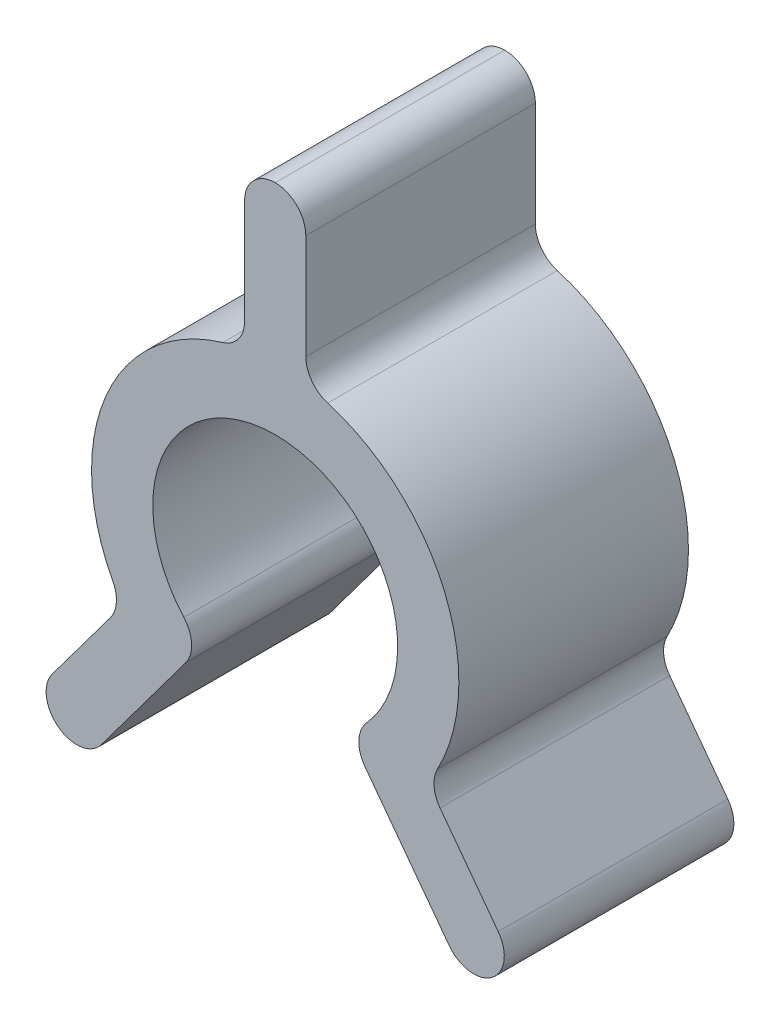
ISO-10303-21;
HEADER;
FILE_DESCRIPTION(('STEP AP214'),'2;1');
FILE_NAME('part.step','',(''),(''),'','','');
FILE_SCHEMA(('AUTOMOTIVE_DESIGN { 1 0 10303 214 1 1 1 1 }'));
ENDSEC;
DATA;
#1=APPLICATION_CONTEXT('core data for automotive mechanical design processes');
#2=APPLICATION_PROTOCOL_DEFINITION('international standard','automotive_design',2000,#1);
#3=PRODUCT_CONTEXT('',#1,'mechanical');
#4=PRODUCT('Part','Part','',(#3));
#5=PRODUCT_RELATED_PRODUCT_CATEGORY('part','',(#4));
#6=PRODUCT_DEFINITION_FORMATION('','',#4);
#7=PRODUCT_DEFINITION_CONTEXT('part definition',#1,'design');
#8=PRODUCT_DEFINITION('design','',#6,#7);
#9=PRODUCT_DEFINITION_SHAPE('','',#8);
#10=(LENGTH_UNIT() NAMED_UNIT(*) SI_UNIT(.MILLI.,.METRE.));
#11=(NAMED_UNIT(*) PLANE_ANGLE_UNIT() SI_UNIT($,.RADIAN.));
#12=(NAMED_UNIT(*) SI_UNIT($,.STERADIAN.) SOLID_ANGLE_UNIT());
#13=UNCERTAINTY_MEASURE_WITH_UNIT(LENGTH_MEASURE(1.E-05),#10,'distance_accuracy_value','');
#14=(GEOMETRIC_REPRESENTATION_CONTEXT(3) GLOBAL_UNCERTAINTY_ASSIGNED_CONTEXT((#13)) GLOBAL_UNIT_ASSIGNED_CONTEXT((#10,
#11,#12)) REPRESENTATION_CONTEXT('',''));
#15=CARTESIAN_POINT('',(0.,0.,0.));
#16=DIRECTION('',(0.,0.,1.));
#17=DIRECTION('',(1.,0.,0.));
#18=AXIS2_PLACEMENT_3D('',#15,#16,#17);
#19=CARTESIAN_POINT('',(0.,0.,7.5));
#20=DIRECTION('',(0.,0.,-1.));
#21=DIRECTION('',(-1.,0.,0.));
#22=AXIS2_PLACEMENT_3D('',#19,#20,#21);
#23=CYLINDRICAL_SURFACE('',#22,4.);
#24=CARTESIAN_POINT('',(0.,0.,2.));
#25=DIRECTION('',(0.,0.,-1.));
#26=DIRECTION('',(-1.,0.,0.));
#27=AXIS2_PLACEMENT_3D('',#24,#25,#26);
#28=CIRCLE('',#27,4.);
#29=CARTESIAN_POINT('',(0.,4.,2.));
#30=VERTEX_POINT('',#29);
#31=CARTESIAN_POINT('',(-3.46410161513775,2.,2.));
#32=VERTEX_POINT('',#31);
#33=EDGE_CURVE('E247',#30,#32,#28,.F.);
#34=ORIENTED_EDGE('',*,*,#33,.F.);
#35=CARTESIAN_POINT('',(0.,0.,2.));
#36=DIRECTION('',(0.,0.,-1.));
#37=DIRECTION('',(-1.,0.,0.));
#38=AXIS2_PLACEMENT_3D('',#35,#36,#37);
#39=CIRCLE('',#38,4.);
#40=CARTESIAN_POINT('',(3.46410161513775,2.,2.));
#41=VERTEX_POINT('',#40);
#42=EDGE_CURVE('E269',#41,#30,#39,.F.);
#43=ORIENTED_EDGE('',*,*,#42,.F.);
#44=DIRECTION('',(0.,0.,-1.));
#45=VECTOR('',#44,1.);
#46=CARTESIAN_POINT('',(3.46410161513775,2.,2.));
#47=LINE('',#46,#45);
#48=CARTESIAN_POINT('',(3.46410161513775,2.,0.));
#49=VERTEX_POINT('',#48);
#50=EDGE_CURVE('E272',#41,#49,#47,.T.);
#51=ORIENTED_EDGE('',*,*,#50,.T.);
#52=CARTESIAN_POINT('',(0.,0.,0.));
#53=DIRECTION('',(0.,0.,1.));
#54=DIRECTION('',(1.,0.,0.));
#55=AXIS2_PLACEMENT_3D('',#52,#53,#54);
#56=CIRCLE('',#55,4.);
#57=CARTESIAN_POINT('',(2.9853643169582,-2.66225466382026,0.));
#58=VERTEX_POINT('',#57);
#59=EDGE_CURVE('E327',#58,#49,#56,.T.);
#60=ORIENTED_EDGE('',*,*,#59,.F.);
#61=DIRECTION('',(0.,0.,-1.));
#62=VECTOR('',#61,1.);
#63=CARTESIAN_POINT('',(2.9853643169582,-2.66225466382026,7.5));
#64=LINE('',#63,#62);
#65=CARTESIAN_POINT('',(2.9853643169582,-2.66225466382026,7.5));
#66=VERTEX_POINT('',#65);
#67=EDGE_CURVE('E408',#58,#66,#64,.F.);
#68=ORIENTED_EDGE('',*,*,#67,.T.);
#69=CARTESIAN_POINT('',(0.,0.,7.5));
#70=DIRECTION('',(0.,0.,1.));
#71=DIRECTION('',(1.,0.,0.));
#72=AXIS2_PLACEMENT_3D('',#69,#70,#71);
#73=CIRCLE('',#72,4.);
#74=CARTESIAN_POINT('',(-2.9853643169582,-2.66225466382026,7.5));
#75=VERTEX_POINT('',#74);
#76=EDGE_CURVE('E298',#66,#75,#73,.T.);
#77=ORIENTED_EDGE('',*,*,#76,.T.);
#78=DIRECTION('',(0.,0.,-1.));
#79=VECTOR('',#78,1.);
#80=CARTESIAN_POINT('',(-2.9853643169582,-2.66225466382026,7.5));
#81=LINE('',#80,#79);
#82=CARTESIAN_POINT('',(-2.9853643169582,-2.66225466382026,0.));
#83=VERTEX_POINT('',#82);
#84=EDGE_CURVE('E406',#75,#83,#81,.T.);
#85=ORIENTED_EDGE('',*,*,#84,.T.);
#86=CARTESIAN_POINT('',(-3.46410161513775,2.,0.));
#87=VERTEX_POINT('',#86);
#88=EDGE_CURVE('E258',#87,#83,#56,.T.);
#89=ORIENTED_EDGE('',*,*,#88,.F.);
#90=DIRECTION('',(0.,0.,-1.));
#91=VECTOR('',#90,1.);
#92=CARTESIAN_POINT('',(-3.46410161513775,2.,2.));
#93=LINE('',#92,#91);
#94=EDGE_CURVE('E239',#32,#87,#93,.T.);
#95=ORIENTED_EDGE('',*,*,#94,.F.);
#96=EDGE_LOOP('',(#34,#43,#51,#60,#68,#77,#85,#89,#95));
#97=FACE_BOUND('',#96,.T.);
#98=ADVANCED_FACE('F34',(#97),#23,.F.);
#99=CARTESIAN_POINT('',(0.,0.,7.5));
#100=DIRECTION('',(0.,0.,-1.));
#101=DIRECTION('',(-1.,0.,0.));
#102=AXIS2_PLACEMENT_3D('',#99,#100,#101);
#103=CYLINDRICAL_SURFACE('',#102,6.);
#104=CARTESIAN_POINT('',(0.,0.,0.));
#105=DIRECTION('',(0.,0.,1.));
#106=DIRECTION('',(1.,0.,0.));
#107=AXIS2_PLACEMENT_3D('',#104,#105,#106);
#108=CIRCLE('',#107,6.);
#109=CARTESIAN_POINT('',(5.30329882536313,-2.80624688309886,0.));
#110=VERTEX_POINT('',#109);
#111=CARTESIAN_POINT('',(1.71428571428571,5.74988908499946,0.));
#112=VERTEX_POINT('',#111);
#113=EDGE_CURVE('E308',#110,#112,#108,.T.);
#114=ORIENTED_EDGE('',*,*,#113,.T.);
#115=DIRECTION('',(0.,0.,-1.));
#116=VECTOR('',#115,1.);
#117=CARTESIAN_POINT('',(1.71428571428571,5.74988908499946,7.5));
#118=LINE('',#117,#116);
#119=CARTESIAN_POINT('',(1.71428571428571,5.74988908499946,7.5));
#120=VERTEX_POINT('',#119);
#121=EDGE_CURVE('E384',#112,#120,#118,.F.);
#122=ORIENTED_EDGE('',*,*,#121,.T.);
#123=CARTESIAN_POINT('',(0.,0.,7.5));
#124=DIRECTION('',(0.,0.,1.));
#125=DIRECTION('',(1.,0.,0.));
#126=AXIS2_PLACEMENT_3D('',#123,#124,#125);
#127=CIRCLE('',#126,6.);
#128=CARTESIAN_POINT('',(5.30329882536313,-2.80624688309886,7.5));
#129=VERTEX_POINT('',#128);
#130=EDGE_CURVE('E279',#129,#120,#127,.T.);
#131=ORIENTED_EDGE('',*,*,#130,.F.);
#132=DIRECTION('',(0.,0.,-1.));
#133=VECTOR('',#132,1.);
#134=CARTESIAN_POINT('',(5.30329882536313,-2.80624688309886,7.5));
#135=LINE('',#134,#133);
#136=EDGE_CURVE('E381',#129,#110,#135,.T.);
#137=ORIENTED_EDGE('',*,*,#136,.T.);
#138=EDGE_LOOP('',(#114,#122,#131,#137));
#139=FACE_BOUND('',#138,.T.);
#140=ADVANCED_FACE('F517',(#139),#103,.T.);
#141=CARTESIAN_POINT('',(1.,0.,7.5));
#142=DIRECTION('',(-1.,0.,0.));
#143=DIRECTION('',(0.,0.,1.));
#144=AXIS2_PLACEMENT_3D('',#141,#142,#143);
#145=PLANE('',#144);
#146=DIRECTION('',(0.,1.,0.));
#147=VECTOR('',#146,1.);
#148=CARTESIAN_POINT('',(1.,0.,0.));
#149=LINE('',#148,#147);
#150=CARTESIAN_POINT('',(1.,6.70820393249937,0.));
#151=VERTEX_POINT('',#150);
#152=CARTESIAN_POINT('',(1.,10.1276449163926,0.));
#153=VERTEX_POINT('',#152);
#154=EDGE_CURVE('E311',#151,#153,#149,.T.);
#155=ORIENTED_EDGE('',*,*,#154,.T.);
#156=DIRECTION('',(0.,0.,-1.));
#157=VECTOR('',#156,1.);
#158=CARTESIAN_POINT('',(1.,10.1276449163926,7.5));
#159=LINE('',#158,#157);
#160=CARTESIAN_POINT('',(1.,10.1276449163926,7.5));
#161=VERTEX_POINT('',#160);
#162=EDGE_CURVE('E379',#153,#161,#159,.F.);
#163=ORIENTED_EDGE('',*,*,#162,.T.);
#164=DIRECTION('',(0.,1.,0.));
#165=VECTOR('',#164,1.);
#166=CARTESIAN_POINT('',(1.,0.,7.5));
#167=LINE('',#166,#165);
#168=CARTESIAN_POINT('',(1.,6.70820393249937,7.5));
#169=VERTEX_POINT('',#168);
#170=EDGE_CURVE('E282',#169,#161,#167,.T.);
#171=ORIENTED_EDGE('',*,*,#170,.F.);
#172=DIRECTION('',(0.,0.,1.));
#173=VECTOR('',#172,1.);
#174=CARTESIAN_POINT('',(1.,6.70820393249937,0.));
#175=LINE('',#174,#173);
#176=EDGE_CURVE('E376',#169,#151,#175,.F.);
#177=ORIENTED_EDGE('',*,*,#176,.T.);
#178=EDGE_LOOP('',(#155,#163,#171,#177));
#179=FACE_BOUND('',#178,.T.);
#180=ADVANCED_FACE('F526',(#179),#145,.F.);
#181=CARTESIAN_POINT('',(-1.,0.,7.5));
#182=DIRECTION('',(-1.,0.,0.));
#183=DIRECTION('',(0.,0.,1.));
#184=AXIS2_PLACEMENT_3D('',#181,#182,#183);
#185=PLANE('',#184);
#186=DIRECTION('',(0.,1.,0.));
#187=VECTOR('',#186,1.);
#188=CARTESIAN_POINT('',(-1.,0.,0.));
#189=LINE('',#188,#187);
#190=CARTESIAN_POINT('',(-1.,6.70820393249937,0.));
#191=VERTEX_POINT('',#190);
#192=CARTESIAN_POINT('',(-1.,10.1276449163926,0.));
#193=VERTEX_POINT('',#192);
#194=EDGE_CURVE('E315',#191,#193,#189,.T.);
#195=ORIENTED_EDGE('',*,*,#194,.F.);
#196=DIRECTION('',(0.,0.,-1.));
#197=VECTOR('',#196,1.);
#198=CARTESIAN_POINT('',(-1.,6.70820393249937,7.5));
#199=LINE('',#198,#197);
#200=CARTESIAN_POINT('',(-1.,6.70820393249937,7.5));
#201=VERTEX_POINT('',#200);
#202=EDGE_CURVE('E342',#191,#201,#199,.F.);
#203=ORIENTED_EDGE('',*,*,#202,.T.);
#204=DIRECTION('',(0.,1.,0.));
#205=VECTOR('',#204,1.);
#206=CARTESIAN_POINT('',(-1.,0.,7.5));
#207=LINE('',#206,#205);
#208=CARTESIAN_POINT('',(-1.,10.1276449163926,7.5));
#209=VERTEX_POINT('',#208);
#210=EDGE_CURVE('E286',#201,#209,#207,.T.);
#211=ORIENTED_EDGE('',*,*,#210,.T.);
#212=DIRECTION('',(0.,0.,-1.));
#213=VECTOR('',#212,1.);
#214=CARTESIAN_POINT('',(-1.,10.1276449163926,0.));
#215=LINE('',#214,#213);
#216=EDGE_CURVE('E339',#209,#193,#215,.T.);
#217=ORIENTED_EDGE('',*,*,#216,.T.);
#218=EDGE_LOOP('',(#195,#203,#211,#217));
#219=FACE_BOUND('',#218,.T.);
#220=ADVANCED_FACE('F541',(#219),#185,.T.);
#221=CARTESIAN_POINT('',(0.,0.,7.5));
#222=DIRECTION('',(0.,0.,-1.));
#223=DIRECTION('',(-1.,0.,0.));
#224=AXIS2_PLACEMENT_3D('',#221,#222,#223);
#225=CYLINDRICAL_SURFACE('',#224,6.);
#226=CARTESIAN_POINT('',(0.,0.,7.5));
#227=DIRECTION('',(0.,0.,1.));
#228=DIRECTION('',(1.,0.,0.));
#229=AXIS2_PLACEMENT_3D('',#226,#227,#228);
#230=CIRCLE('',#229,6.);
#231=CARTESIAN_POINT('',(-1.71428571428571,5.74988908499946,7.5));
#232=VERTEX_POINT('',#231);
#233=CARTESIAN_POINT('',(-5.30329882536313,-2.80624688309886,7.5));
#234=VERTEX_POINT('',#233);
#235=EDGE_CURVE('E289',#232,#234,#230,.T.);
#236=ORIENTED_EDGE('',*,*,#235,.F.);
#237=DIRECTION('',(0.,0.,-1.));
#238=VECTOR('',#237,1.);
#239=CARTESIAN_POINT('',(-1.71428571428571,5.74988908499946,7.5));
#240=LINE('',#239,#238);
#241=CARTESIAN_POINT('',(-1.71428571428571,5.74988908499946,0.));
#242=VERTEX_POINT('',#241);
#243=EDGE_CURVE('E336',#232,#242,#240,.T.);
#244=ORIENTED_EDGE('',*,*,#243,.T.);
#245=CARTESIAN_POINT('',(0.,0.,0.));
#246=DIRECTION('',(0.,0.,1.));
#247=DIRECTION('',(1.,0.,0.));
#248=AXIS2_PLACEMENT_3D('',#245,#246,#247);
#249=CIRCLE('',#248,6.);
#250=CARTESIAN_POINT('',(-5.30329882536313,-2.80624688309886,0.));
#251=VERTEX_POINT('',#250);
#252=EDGE_CURVE('E318',#242,#251,#249,.T.);
#253=ORIENTED_EDGE('',*,*,#252,.T.);
#254=DIRECTION('',(0.,0.,-1.));
#255=VECTOR('',#254,1.);
#256=CARTESIAN_POINT('',(-5.30329882536313,-2.80624688309886,7.5));
#257=LINE('',#256,#255);
#258=EDGE_CURVE('E307',#251,#234,#257,.F.);
#259=ORIENTED_EDGE('',*,*,#258,.T.);
#260=EDGE_LOOP('',(#236,#244,#253,#259));
#261=FACE_BOUND('',#260,.T.);
#262=ADVANCED_FACE('F549',(#261),#225,.T.);
#263=CARTESIAN_POINT('',(-1.6027695300367,1.19629838818998,7.5));
#264=DIRECTION('',(-0.80138476501835,0.598149194094988,0.));
#265=DIRECTION('',(-0.598149194094988,-0.801384765018351,0.));
#266=AXIS2_PLACEMENT_3D('',#263,#264,#265);
#267=PLANE('',#266);
#268=DIRECTION('',(0.598149194094988,0.801384765018351,0.));
#269=VECTOR('',#268,1.);
#270=CARTESIAN_POINT('',(-1.6027695300367,1.19629838818998,0.));
#271=LINE('',#270,#269);
#272=CARTESIAN_POINT('',(-7.28518687393909,-6.41685687948436,0.));
#273=VERTEX_POINT('',#272);
#274=CARTESIAN_POINT('',(-5.3857971979053,-3.87210389104365,0.));
#275=VERTEX_POINT('',#274);
#276=EDGE_CURVE('E321',#273,#275,#271,.T.);
#277=ORIENTED_EDGE('',*,*,#276,.F.);
#278=DIRECTION('',(0.,0.,-1.));
#279=VECTOR('',#278,1.);
#280=CARTESIAN_POINT('',(-7.28518687393909,-6.41685687948436,7.5));
#281=LINE('',#280,#279);
#282=CARTESIAN_POINT('',(-7.28518687393909,-6.41685687948436,7.5));
#283=VERTEX_POINT('',#282);
#284=EDGE_CURVE('E404',#273,#283,#281,.F.);
#285=ORIENTED_EDGE('',*,*,#284,.T.);
#286=DIRECTION('',(0.598149194094988,0.801384765018351,0.));
#287=VECTOR('',#286,1.);
#288=CARTESIAN_POINT('',(-1.6027695300367,1.19629838818998,7.5));
#289=LINE('',#288,#287);
#290=CARTESIAN_POINT('',(-5.3857971979053,-3.87210389104365,7.5));
#291=VERTEX_POINT('',#290);
#292=EDGE_CURVE('E292',#283,#291,#289,.T.);
#293=ORIENTED_EDGE('',*,*,#292,.T.);
#294=DIRECTION('',(0.,0.,-1.));
#295=VECTOR('',#294,1.);
#296=CARTESIAN_POINT('',(-5.3857971979053,-3.87210389104365,7.5));
#297=LINE('',#296,#295);
#298=EDGE_CURVE('E401',#291,#275,#297,.T.);
#299=ORIENTED_EDGE('',*,*,#298,.T.);
#300=EDGE_LOOP('',(#277,#285,#293,#299));
#301=FACE_BOUND('',#300,.T.);
#302=ADVANCED_FACE('F559',(#301),#267,.T.);
#303=CARTESIAN_POINT('',(0.,0.,7.5));
#304=DIRECTION('',(-0.80138476501835,0.598149194094988,0.));
#305=DIRECTION('',(-0.598149194094988,-0.80138476501835,0.));
#306=AXIS2_PLACEMENT_3D('',#303,#304,#305);
#307=PLANE('',#306);
#308=DIRECTION('',(0.598149194094988,0.801384765018351,0.));
#309=VECTOR('',#308,1.);
#310=CARTESIAN_POINT('',(0.,0.,7.5));
#311=LINE('',#310,#309);
#312=CARTESIAN_POINT('',(-5.68241734390239,-7.61315526767434,7.5));
#313=VERTEX_POINT('',#312);
#314=CARTESIAN_POINT('',(-2.9303206311794,-3.92596752387031,7.5));
#315=VERTEX_POINT('',#314);
#316=EDGE_CURVE('E295',#313,#315,#311,.T.);
#317=ORIENTED_EDGE('',*,*,#316,.F.);
#318=DIRECTION('',(0.,0.,-1.));
#319=VECTOR('',#318,1.);
#320=CARTESIAN_POINT('',(-5.68241734390239,-7.61315526767433,0.));
#321=LINE('',#320,#319);
#322=CARTESIAN_POINT('',(-5.68241734390239,-7.61315526767434,0.));
#323=VERTEX_POINT('',#322);
#324=EDGE_CURVE('E398',#313,#323,#321,.T.);
#325=ORIENTED_EDGE('',*,*,#324,.T.);
#326=DIRECTION('',(0.598149194094988,0.801384765018351,0.));
#327=VECTOR('',#326,1.);
#328=CARTESIAN_POINT('',(0.,0.,0.));
#329=LINE('',#328,#327);
#330=CARTESIAN_POINT('',(-2.9303206311794,-3.92596752387031,0.));
#331=VERTEX_POINT('',#330);
#332=EDGE_CURVE('E324',#323,#331,#329,.T.);
#333=ORIENTED_EDGE('',*,*,#332,.T.);
#334=DIRECTION('',(0.,0.,1.));
#335=VECTOR('',#334,1.);
#336=CARTESIAN_POINT('',(-2.93032063117939,-3.92596752387031,7.5));
#337=LINE('',#336,#335);
#338=EDGE_CURVE('E396',#331,#315,#337,.T.);
#339=ORIENTED_EDGE('',*,*,#338,.T.);
#340=EDGE_LOOP('',(#317,#325,#333,#339));
#341=FACE_BOUND('',#340,.T.);
#342=ADVANCED_FACE('F571',(#341),#307,.F.);
#343=CARTESIAN_POINT('',(0.,0.,7.5));
#344=DIRECTION('',(0.80138476501835,0.598149194094988,0.));
#345=DIRECTION('',(-0.598149194094988,0.80138476501835,0.));
#346=AXIS2_PLACEMENT_3D('',#343,#344,#345);
#347=PLANE('',#346);
#348=DIRECTION('',(0.598149194094988,-0.80138476501835,0.));
#349=VECTOR('',#348,1.);
#350=CARTESIAN_POINT('',(0.,0.,0.));
#351=LINE('',#350,#349);
#352=CARTESIAN_POINT('',(2.9303206311794,-3.92596752387031,0.));
#353=VERTEX_POINT('',#352);
#354=CARTESIAN_POINT('',(5.68241734390239,-7.61315526767433,0.));
#355=VERTEX_POINT('',#354);
#356=EDGE_CURVE('E330',#353,#355,#351,.T.);
#357=ORIENTED_EDGE('',*,*,#356,.T.);
#358=DIRECTION('',(0.,0.,-1.));
#359=VECTOR('',#358,1.);
#360=CARTESIAN_POINT('',(5.68241734390239,-7.61315526767433,7.5));
#361=LINE('',#360,#359);
#362=CARTESIAN_POINT('',(5.68241734390239,-7.61315526767433,7.5));
#363=VERTEX_POINT('',#362);
#364=EDGE_CURVE('E389',#355,#363,#361,.F.);
#365=ORIENTED_EDGE('',*,*,#364,.T.);
#366=DIRECTION('',(0.598149194094988,-0.80138476501835,0.));
#367=VECTOR('',#366,1.);
#368=CARTESIAN_POINT('',(0.,0.,7.5));
#369=LINE('',#368,#367);
#370=CARTESIAN_POINT('',(2.9303206311794,-3.92596752387031,7.5));
#371=VERTEX_POINT('',#370);
#372=EDGE_CURVE('E301',#371,#363,#369,.T.);
#373=ORIENTED_EDGE('',*,*,#372,.F.);
#374=DIRECTION('',(0.,0.,1.));
#375=VECTOR('',#374,1.);
#376=CARTESIAN_POINT('',(2.93032063117939,-3.92596752387031,0.));
#377=LINE('',#376,#375);
#378=EDGE_CURVE('E386',#371,#353,#377,.F.);
#379=ORIENTED_EDGE('',*,*,#378,.T.);
#380=EDGE_LOOP('',(#357,#365,#373,#379));
#381=FACE_BOUND('',#380,.T.);
#382=ADVANCED_FACE('F494',(#381),#347,.F.);
#383=CARTESIAN_POINT('',(1.6027695300367,1.19629838818998,7.5));
#384=DIRECTION('',(-0.80138476501835,-0.598149194094988,0.));
#385=DIRECTION('',(0.598149194094988,-0.80138476501835,0.));
#386=AXIS2_PLACEMENT_3D('',#383,#384,#385);
#387=PLANE('',#386);
#388=DIRECTION('',(-0.598149194094988,0.80138476501835,0.));
#389=VECTOR('',#388,1.);
#390=CARTESIAN_POINT('',(1.6027695300367,1.19629838818998,7.5));
#391=LINE('',#390,#389);
#392=CARTESIAN_POINT('',(7.28518687393909,-6.41685687948436,7.5));
#393=VERTEX_POINT('',#392);
#394=CARTESIAN_POINT('',(5.3857971979053,-3.87210389104366,7.5));
#395=VERTEX_POINT('',#394);
#396=EDGE_CURVE('E304',#393,#395,#391,.T.);
#397=ORIENTED_EDGE('',*,*,#396,.F.);
#398=DIRECTION('',(0.,0.,-1.));
#399=VECTOR('',#398,1.);
#400=CARTESIAN_POINT('',(7.28518687393909,-6.41685687948436,7.5));
#401=LINE('',#400,#399);
#402=CARTESIAN_POINT('',(7.28518687393909,-6.41685687948436,0.));
#403=VERTEX_POINT('',#402);
#404=EDGE_CURVE('E394',#393,#403,#401,.T.);
#405=ORIENTED_EDGE('',*,*,#404,.T.);
#406=DIRECTION('',(-0.598149194094988,0.80138476501835,0.));
#407=VECTOR('',#406,1.);
#408=CARTESIAN_POINT('',(1.6027695300367,1.19629838818998,0.));
#409=LINE('',#408,#407);
#410=CARTESIAN_POINT('',(5.3857971979053,-3.87210389104366,0.));
#411=VERTEX_POINT('',#410);
#412=EDGE_CURVE('E283',#403,#411,#409,.T.);
#413=ORIENTED_EDGE('',*,*,#412,.T.);
#414=DIRECTION('',(0.,0.,1.));
#415=VECTOR('',#414,1.);
#416=CARTESIAN_POINT('',(5.3857971979053,-3.87210389104366,7.5));
#417=LINE('',#416,#415);
#418=EDGE_CURVE('E392',#411,#395,#417,.T.);
#419=ORIENTED_EDGE('',*,*,#418,.T.);
#420=EDGE_LOOP('',(#397,#405,#413,#419));
#421=FACE_BOUND('',#420,.T.);
#422=ADVANCED_FACE('F508',(#421),#387,.F.);
#423=CARTESIAN_POINT('',(0.,0.,7.5));
#424=DIRECTION('',(0.,0.,1.));
#425=DIRECTION('',(1.,0.,0.));
#426=AXIS2_PLACEMENT_3D('',#423,#424,#425);
#427=PLANE('',#426);
#428=CARTESIAN_POINT('',(0.,10.1276449163926,7.5));
#429=DIRECTION('',(0.,0.,1.));
#430=DIRECTION('',(1.,0.,0.));
#431=AXIS2_PLACEMENT_3D('',#428,#429,#430);
#432=CIRCLE('',#431,1.);
#433=CARTESIAN_POINT('',(0.,11.1276449163926,7.5));
#434=VERTEX_POINT('',#433);
#435=EDGE_CURVE('E372',#161,#434,#432,.T.);
#436=ORIENTED_EDGE('',*,*,#435,.T.);
#437=CARTESIAN_POINT('',(0.,10.1276449163926,7.5));
#438=DIRECTION('',(0.,0.,1.));
#439=DIRECTION('',(1.,0.,0.));
#440=AXIS2_PLACEMENT_3D('',#437,#438,#439);
#441=CIRCLE('',#440,1.);
#442=EDGE_CURVE('E374',#434,#209,#441,.T.);
#443=ORIENTED_EDGE('',*,*,#442,.T.);
#444=ORIENTED_EDGE('',*,*,#210,.F.);
#445=CARTESIAN_POINT('',(-2.,6.70820393249937,7.5));
#446=DIRECTION('',(0.,0.,1.));
#447=DIRECTION('',(1.,0.,0.));
#448=AXIS2_PLACEMENT_3D('',#445,#446,#447);
#449=CIRCLE('',#448,1.);
#450=EDGE_CURVE('E412',#201,#232,#449,.F.);
#451=ORIENTED_EDGE('',*,*,#450,.T.);
#452=ORIENTED_EDGE('',*,*,#235,.T.);
#453=CARTESIAN_POINT('',(-6.18718196292365,-3.27395469694867,7.5));
#454=DIRECTION('',(0.,0.,1.));
#455=DIRECTION('',(1.,0.,0.));
#456=AXIS2_PLACEMENT_3D('',#453,#454,#455);
#457=CIRCLE('',#456,1.);
#458=EDGE_CURVE('E420',#234,#291,#457,.F.);
#459=ORIENTED_EDGE('',*,*,#458,.T.);
#460=ORIENTED_EDGE('',*,*,#292,.F.);
#461=CARTESIAN_POINT('',(-6.48380210892074,-7.01500607357934,7.5));
#462=DIRECTION('',(0.,0.,1.));
#463=DIRECTION('',(1.,0.,0.));
#464=AXIS2_PLACEMENT_3D('',#461,#462,#463);
#465=CIRCLE('',#464,1.);
#466=CARTESIAN_POINT('',(-7.08195130301573,-7.8163908385977,7.5));
#467=VERTEX_POINT('',#466);
#468=EDGE_CURVE('E364',#283,#467,#465,.T.);
#469=ORIENTED_EDGE('',*,*,#468,.T.);
#470=CARTESIAN_POINT('',(-6.48380210892074,-7.01500607357935,7.5));
#471=DIRECTION('',(0.,0.,1.));
#472=DIRECTION('',(1.,0.,0.));
#473=AXIS2_PLACEMENT_3D('',#470,#471,#472);
#474=CIRCLE('',#473,1.);
#475=EDGE_CURVE('E366',#467,#313,#474,.T.);
#476=ORIENTED_EDGE('',*,*,#475,.T.);
#477=ORIENTED_EDGE('',*,*,#316,.T.);
#478=CARTESIAN_POINT('',(-3.73170539619774,-3.32781832977532,7.5));
#479=DIRECTION('',(0.,0.,1.));
#480=DIRECTION('',(1.,0.,0.));
#481=AXIS2_PLACEMENT_3D('',#478,#479,#480);
#482=CIRCLE('',#481,1.);
#483=EDGE_CURVE('E360',#315,#75,#482,.T.);
#484=ORIENTED_EDGE('',*,*,#483,.T.);
#485=ORIENTED_EDGE('',*,*,#76,.F.);
#486=CARTESIAN_POINT('',(3.73170539619774,-3.32781832977533,7.5));
#487=DIRECTION('',(0.,0.,1.));
#488=DIRECTION('',(1.,0.,0.));
#489=AXIS2_PLACEMENT_3D('',#486,#487,#488);
#490=CIRCLE('',#489,1.);
#491=EDGE_CURVE('E362',#66,#371,#490,.T.);
#492=ORIENTED_EDGE('',*,*,#491,.T.);
#493=ORIENTED_EDGE('',*,*,#372,.T.);
#494=CARTESIAN_POINT('',(6.48380210892074,-7.01500607357934,7.5));
#495=DIRECTION('',(0.,0.,1.));
#496=DIRECTION('',(1.,0.,0.));
#497=AXIS2_PLACEMENT_3D('',#494,#495,#496);
#498=CIRCLE('',#497,1.);
#499=CARTESIAN_POINT('',(7.08195130301572,-7.81639083859769,7.5));
#500=VERTEX_POINT('',#499);
#501=EDGE_CURVE('E370',#363,#500,#498,.T.);
#502=ORIENTED_EDGE('',*,*,#501,.T.);
#503=CARTESIAN_POINT('',(6.48380210892074,-7.01500607357934,7.5));
#504=DIRECTION('',(0.,0.,1.));
#505=DIRECTION('',(1.,0.,0.));
#506=AXIS2_PLACEMENT_3D('',#503,#504,#505);
#507=CIRCLE('',#506,1.);
#508=EDGE_CURVE('E368',#500,#393,#507,.T.);
#509=ORIENTED_EDGE('',*,*,#508,.T.);
#510=ORIENTED_EDGE('',*,*,#396,.T.);
#511=CARTESIAN_POINT('',(6.18718196292365,-3.27395469694867,7.5));
#512=DIRECTION('',(0.,0.,1.));
#513=DIRECTION('',(1.,0.,0.));
#514=AXIS2_PLACEMENT_3D('',#511,#512,#513);
#515=CIRCLE('',#514,1.);
#516=EDGE_CURVE('E424',#395,#129,#515,.F.);
#517=ORIENTED_EDGE('',*,*,#516,.T.);
#518=ORIENTED_EDGE('',*,*,#130,.T.);
#519=CARTESIAN_POINT('',(2.,6.70820393249937,7.5));
#520=DIRECTION('',(0.,0.,1.));
#521=DIRECTION('',(1.,0.,0.));
#522=AXIS2_PLACEMENT_3D('',#519,#520,#521);
#523=CIRCLE('',#522,1.);
#524=EDGE_CURVE('E416',#120,#169,#523,.F.);
#525=ORIENTED_EDGE('',*,*,#524,.T.);
#526=ORIENTED_EDGE('',*,*,#170,.T.);
#527=EDGE_LOOP('',(#436,#443,#444,#451,#452,#459,#460,#469,#476,#477,#484,#485,#492,#493,#502,
#509,#510,#517,#518,#525,#526));
#528=FACE_BOUND('',#527,.T.);
#529=ADVANCED_FACE('F492',(#528),#427,.T.);
#530=CARTESIAN_POINT('',(0.,0.,0.));
#531=DIRECTION('',(0.,0.,1.));
#532=DIRECTION('',(1.,0.,0.));
#533=AXIS2_PLACEMENT_3D('',#530,#531,#532);
#534=PLANE('',#533);
#535=DIRECTION('',(0.,-1.,0.));
#536=VECTOR('',#535,1.);
#537=CARTESIAN_POINT('',(-0.2,0.,0.));
#538=LINE('',#537,#536);
#539=CARTESIAN_POINT('',(-0.2,3.8,0.));
#540=VERTEX_POINT('',#539);
#541=CARTESIAN_POINT('',(-0.2,2.2,0.));
#542=VERTEX_POINT('',#541);
#543=EDGE_CURVE('E460',#540,#542,#538,.T.);
#544=ORIENTED_EDGE('',*,*,#543,.T.);
#545=CARTESIAN_POINT('',(-0.4,2.2,0.));
#546=DIRECTION('',(0.,0.,1.));
#547=DIRECTION('',(1.,0.,0.));
#548=AXIS2_PLACEMENT_3D('',#545,#546,#547);
#549=CIRCLE('',#548,0.2);
#550=CARTESIAN_POINT('',(-0.4,2.,0.));
#551=VERTEX_POINT('',#550);
#552=EDGE_CURVE('E445',#542,#551,#549,.F.);
#553=ORIENTED_EDGE('',*,*,#552,.T.);
#554=DIRECTION('',(-1.,0.,0.));
#555=VECTOR('',#554,1.);
#556=CARTESIAN_POINT('',(0.,2.,0.));
#557=LINE('',#556,#555);
#558=EDGE_CURVE('E255',#551,#87,#557,.T.);
#559=ORIENTED_EDGE('',*,*,#558,.T.);
#560=ORIENTED_EDGE('',*,*,#88,.T.);
#561=CARTESIAN_POINT('',(-3.73170539619774,-3.32781832977532,0.));
#562=DIRECTION('',(0.,0.,1.));
#563=DIRECTION('',(1.,0.,0.));
#564=AXIS2_PLACEMENT_3D('',#561,#562,#563);
#565=CIRCLE('',#564,1.);
#566=EDGE_CURVE('E344',#83,#331,#565,.F.);
#567=ORIENTED_EDGE('',*,*,#566,.T.);
#568=ORIENTED_EDGE('',*,*,#332,.F.);
#569=CARTESIAN_POINT('',(-6.48380210892074,-7.01500607357935,0.));
#570=DIRECTION('',(0.,0.,1.));
#571=DIRECTION('',(1.,0.,0.));
#572=AXIS2_PLACEMENT_3D('',#569,#570,#571);
#573=CIRCLE('',#572,1.);
#574=CARTESIAN_POINT('',(-7.08195130301573,-7.8163908385977,0.));
#575=VERTEX_POINT('',#574);
#576=EDGE_CURVE('E350',#323,#575,#573,.F.);
#577=ORIENTED_EDGE('',*,*,#576,.T.);
#578=CARTESIAN_POINT('',(-6.48380210892074,-7.01500607357934,0.));
#579=DIRECTION('',(0.,0.,1.));
#580=DIRECTION('',(1.,0.,0.));
#581=AXIS2_PLACEMENT_3D('',#578,#579,#580);
#582=CIRCLE('',#581,1.);
#583=EDGE_CURVE('E348',#575,#273,#582,.F.);
#584=ORIENTED_EDGE('',*,*,#583,.T.);
#585=ORIENTED_EDGE('',*,*,#276,.T.);
#586=CARTESIAN_POINT('',(-6.18718196292365,-3.27395469694867,0.));
#587=DIRECTION('',(0.,0.,1.));
#588=DIRECTION('',(1.,0.,0.));
#589=AXIS2_PLACEMENT_3D('',#586,#587,#588);
#590=CIRCLE('',#589,1.);
#591=EDGE_CURVE('E418',#275,#251,#590,.T.);
#592=ORIENTED_EDGE('',*,*,#591,.T.);
#593=ORIENTED_EDGE('',*,*,#252,.F.);
#594=CARTESIAN_POINT('',(-2.,6.70820393249937,0.));
#595=DIRECTION('',(0.,0.,1.));
#596=DIRECTION('',(1.,0.,0.));
#597=AXIS2_PLACEMENT_3D('',#594,#595,#596);
#598=CIRCLE('',#597,1.);
#599=EDGE_CURVE('E410',#242,#191,#598,.T.);
#600=ORIENTED_EDGE('',*,*,#599,.T.);
#601=ORIENTED_EDGE('',*,*,#194,.T.);
#602=CARTESIAN_POINT('',(0.,10.1276449163926,0.));
#603=DIRECTION('',(0.,0.,1.));
#604=DIRECTION('',(1.,0.,0.));
#605=AXIS2_PLACEMENT_3D('',#602,#603,#604);
#606=CIRCLE('',#605,1.);
#607=CARTESIAN_POINT('',(0.,11.1276449163926,0.));
#608=VERTEX_POINT('',#607);
#609=EDGE_CURVE('E358',#193,#608,#606,.F.);
#610=ORIENTED_EDGE('',*,*,#609,.T.);
#611=CARTESIAN_POINT('',(0.,10.1276449163926,0.));
#612=DIRECTION('',(0.,0.,1.));
#613=DIRECTION('',(1.,0.,0.));
#614=AXIS2_PLACEMENT_3D('',#611,#612,#613);
#615=CIRCLE('',#614,1.);
#616=EDGE_CURVE('E356',#608,#153,#615,.F.);
#617=ORIENTED_EDGE('',*,*,#616,.T.);
#618=ORIENTED_EDGE('',*,*,#154,.F.);
#619=CARTESIAN_POINT('',(2.,6.70820393249937,0.));
#620=DIRECTION('',(0.,0.,1.));
#621=DIRECTION('',(1.,0.,0.));
#622=AXIS2_PLACEMENT_3D('',#619,#620,#621);
#623=CIRCLE('',#622,1.);
#624=EDGE_CURVE('E414',#151,#112,#623,.T.);
#625=ORIENTED_EDGE('',*,*,#624,.T.);
#626=ORIENTED_EDGE('',*,*,#113,.F.);
#627=CARTESIAN_POINT('',(6.18718196292365,-3.27395469694867,0.));
#628=DIRECTION('',(0.,0.,1.));
#629=DIRECTION('',(1.,0.,0.));
#630=AXIS2_PLACEMENT_3D('',#627,#628,#629);
#631=CIRCLE('',#630,1.);
#632=EDGE_CURVE('E422',#110,#411,#631,.T.);
#633=ORIENTED_EDGE('',*,*,#632,.T.);
#634=ORIENTED_EDGE('',*,*,#412,.F.);
#635=CARTESIAN_POINT('',(6.48380210892074,-7.01500607357934,0.));
#636=DIRECTION('',(0.,0.,1.));
#637=DIRECTION('',(1.,0.,0.));
#638=AXIS2_PLACEMENT_3D('',#635,#636,#637);
#639=CIRCLE('',#638,1.);
#640=CARTESIAN_POINT('',(7.08195130301572,-7.81639083859769,0.));
#641=VERTEX_POINT('',#640);
#642=EDGE_CURVE('E352',#403,#641,#639,.F.);
#643=ORIENTED_EDGE('',*,*,#642,.T.);
#644=CARTESIAN_POINT('',(6.48380210892074,-7.01500607357934,0.));
#645=DIRECTION('',(0.,0.,1.));
#646=DIRECTION('',(1.,0.,0.));
#647=AXIS2_PLACEMENT_3D('',#644,#645,#646);
#648=CIRCLE('',#647,1.);
#649=EDGE_CURVE('E354',#641,#355,#648,.F.);
#650=ORIENTED_EDGE('',*,*,#649,.T.);
#651=ORIENTED_EDGE('',*,*,#356,.F.);
#652=CARTESIAN_POINT('',(3.73170539619774,-3.32781832977533,0.));
#653=DIRECTION('',(0.,0.,1.));
#654=DIRECTION('',(1.,0.,0.));
#655=AXIS2_PLACEMENT_3D('',#652,#653,#654);
#656=CIRCLE('',#655,1.);
#657=EDGE_CURVE('E346',#353,#58,#656,.F.);
#658=ORIENTED_EDGE('',*,*,#657,.T.);
#659=ORIENTED_EDGE('',*,*,#59,.T.);
#660=DIRECTION('',(-1.,0.,0.));
#661=VECTOR('',#660,1.);
#662=CARTESIAN_POINT('',(0.,2.,0.));
#663=LINE('',#662,#661);
#664=CARTESIAN_POINT('',(0.4,2.,0.));
#665=VERTEX_POINT('',#664);
#666=EDGE_CURVE('E262',#49,#665,#663,.T.);
#667=ORIENTED_EDGE('',*,*,#666,.T.);
#668=CARTESIAN_POINT('',(0.4,2.2,0.));
#669=DIRECTION('',(0.,0.,1.));
#670=DIRECTION('',(1.,0.,0.));
#671=AXIS2_PLACEMENT_3D('',#668,#669,#670);
#672=CIRCLE('',#671,0.2);
#673=CARTESIAN_POINT('',(0.2,2.2,0.));
#674=VERTEX_POINT('',#673);
#675=EDGE_CURVE('E443',#665,#674,#672,.F.);
#676=ORIENTED_EDGE('',*,*,#675,.T.);
#677=DIRECTION('',(0.,-1.,0.));
#678=VECTOR('',#677,1.);
#679=CARTESIAN_POINT('',(0.2,0.,0.));
#680=LINE('',#679,#678);
#681=CARTESIAN_POINT('',(0.2,3.8,0.));
#682=VERTEX_POINT('',#681);
#683=EDGE_CURVE('E259',#682,#674,#680,.T.);
#684=ORIENTED_EDGE('',*,*,#683,.F.);
#685=CARTESIAN_POINT('',(0.,3.8,0.));
#686=DIRECTION('',(0.,0.,1.));
#687=DIRECTION('',(1.,0.,0.));
#688=AXIS2_PLACEMENT_3D('',#685,#686,#687);
#689=CIRCLE('',#688,0.2);
#690=CARTESIAN_POINT('',(0.,4.,0.));
#691=VERTEX_POINT('',#690);
#692=EDGE_CURVE('E50',#682,#691,#689,.T.);
#693=ORIENTED_EDGE('',*,*,#692,.T.);
#694=CARTESIAN_POINT('',(0.,3.8,0.));
#695=DIRECTION('',(0.,0.,1.));
#696=DIRECTION('',(1.,0.,0.));
#697=AXIS2_PLACEMENT_3D('',#694,#695,#696);
#698=CIRCLE('',#697,0.2);
#699=EDGE_CURVE('E43',#691,#540,#698,.T.);
#700=ORIENTED_EDGE('',*,*,#699,.T.);
#701=EDGE_LOOP('',(#544,#553,#559,#560,#567,#568,#577,#584,#585,#592,#593,#600,#601,#610,#617,
#618,#625,#626,#633,#634,#643,#650,#651,#658,#659,#667,#676,#684,#693,#700));
#702=FACE_BOUND('',#701,.T.);
#703=ADVANCED_FACE('F459',(#702),#534,.F.);
#704=CARTESIAN_POINT('',(-2.,6.70820393249937,7.5));
#705=DIRECTION('',(0.,0.,-1.));
#706=DIRECTION('',(-1.,0.,0.));
#707=AXIS2_PLACEMENT_3D('',#704,#705,#706);
#708=CYLINDRICAL_SURFACE('',#707,1.);
#709=ORIENTED_EDGE('',*,*,#450,.F.);
#710=ORIENTED_EDGE('',*,*,#202,.F.);
#711=ORIENTED_EDGE('',*,*,#599,.F.);
#712=ORIENTED_EDGE('',*,*,#243,.F.);
#713=EDGE_LOOP('',(#709,#710,#711,#712));
#714=FACE_BOUND('',#713,.T.);
#715=ADVANCED_FACE('F544',(#714),#708,.F.);
#716=CARTESIAN_POINT('',(0.,10.1276449163926,7.5));
#717=DIRECTION('',(0.,0.,-1.));
#718=DIRECTION('',(-1.,0.,0.));
#719=AXIS2_PLACEMENT_3D('',#716,#717,#718);
#720=CYLINDRICAL_SURFACE('',#719,1.);
#721=DIRECTION('',(0.,0.,-1.));
#722=VECTOR('',#721,1.);
#723=CARTESIAN_POINT('',(0.,11.1276449163926,7.5));
#724=LINE('',#723,#722);
#725=EDGE_CURVE('E312',#434,#608,#724,.T.);
#726=ORIENTED_EDGE('',*,*,#725,.F.);
#727=ORIENTED_EDGE('',*,*,#435,.F.);
#728=ORIENTED_EDGE('',*,*,#162,.F.);
#729=ORIENTED_EDGE('',*,*,#616,.F.);
#730=EDGE_LOOP('',(#726,#727,#728,#729));
#731=FACE_BOUND('',#730,.T.);
#732=ADVANCED_FACE('F531',(#731),#720,.T.);
#733=CARTESIAN_POINT('',(0.,10.1276449163926,7.5));
#734=DIRECTION('',(0.,0.,1.));
#735=DIRECTION('',(1.,0.,0.));
#736=AXIS2_PLACEMENT_3D('',#733,#734,#735);
#737=CYLINDRICAL_SURFACE('',#736,1.);
#738=ORIENTED_EDGE('',*,*,#442,.F.);
#739=ORIENTED_EDGE('',*,*,#725,.T.);
#740=ORIENTED_EDGE('',*,*,#609,.F.);
#741=ORIENTED_EDGE('',*,*,#216,.F.);
#742=EDGE_LOOP('',(#738,#739,#740,#741));
#743=FACE_BOUND('',#742,.T.);
#744=ADVANCED_FACE('F535',(#743),#737,.T.);
#745=CARTESIAN_POINT('',(2.,6.70820393249937,7.5));
#746=DIRECTION('',(0.,0.,-1.));
#747=DIRECTION('',(-1.,0.,0.));
#748=AXIS2_PLACEMENT_3D('',#745,#746,#747);
#749=CYLINDRICAL_SURFACE('',#748,1.);
#750=ORIENTED_EDGE('',*,*,#524,.F.);
#751=ORIENTED_EDGE('',*,*,#121,.F.);
#752=ORIENTED_EDGE('',*,*,#624,.F.);
#753=ORIENTED_EDGE('',*,*,#176,.F.);
#754=EDGE_LOOP('',(#750,#751,#752,#753));
#755=FACE_BOUND('',#754,.T.);
#756=ADVANCED_FACE('F523',(#755),#749,.F.);
#757=CARTESIAN_POINT('',(6.48380210892074,-7.01500607357934,7.5));
#758=DIRECTION('',(0.,0.,-1.));
#759=DIRECTION('',(-1.,0.,0.));
#760=AXIS2_PLACEMENT_3D('',#757,#758,#759);
#761=CYLINDRICAL_SURFACE('',#760,1.);
#762=ORIENTED_EDGE('',*,*,#404,.F.);
#763=ORIENTED_EDGE('',*,*,#508,.F.);
#764=DIRECTION('',(0.,0.,-1.));
#765=VECTOR('',#764,1.);
#766=CARTESIAN_POINT('',(7.08195130301572,-7.81639083859769,7.5));
#767=LINE('',#766,#765);
#768=EDGE_CURVE('E429',#641,#500,#767,.F.);
#769=ORIENTED_EDGE('',*,*,#768,.F.);
#770=ORIENTED_EDGE('',*,*,#642,.F.);
#771=EDGE_LOOP('',(#762,#763,#769,#770));
#772=FACE_BOUND('',#771,.T.);
#773=ADVANCED_FACE('F504',(#772),#761,.T.);
#774=CARTESIAN_POINT('',(6.48380210892074,-7.01500607357934,7.5));
#775=DIRECTION('',(0.,0.,-1.));
#776=DIRECTION('',(-1.,0.,0.));
#777=AXIS2_PLACEMENT_3D('',#774,#775,#776);
#778=CYLINDRICAL_SURFACE('',#777,1.);
#779=ORIENTED_EDGE('',*,*,#501,.F.);
#780=ORIENTED_EDGE('',*,*,#364,.F.);
#781=ORIENTED_EDGE('',*,*,#649,.F.);
#782=ORIENTED_EDGE('',*,*,#768,.T.);
#783=EDGE_LOOP('',(#779,#780,#781,#782));
#784=FACE_BOUND('',#783,.T.);
#785=ADVANCED_FACE('F498',(#784),#778,.T.);
#786=CARTESIAN_POINT('',(-6.48380210892074,-7.01500607357934,7.5));
#787=DIRECTION('',(0.,0.,-1.));
#788=DIRECTION('',(-1.,0.,0.));
#789=AXIS2_PLACEMENT_3D('',#786,#787,#788);
#790=CYLINDRICAL_SURFACE('',#789,1.);
#791=DIRECTION('',(0.,0.,-1.));
#792=VECTOR('',#791,1.);
#793=CARTESIAN_POINT('',(-7.08195130301573,-7.8163908385977,7.5));
#794=LINE('',#793,#792);
#795=EDGE_CURVE('E278',#467,#575,#794,.T.);
#796=ORIENTED_EDGE('',*,*,#795,.F.);
#797=ORIENTED_EDGE('',*,*,#468,.F.);
#798=ORIENTED_EDGE('',*,*,#284,.F.);
#799=ORIENTED_EDGE('',*,*,#583,.F.);
#800=EDGE_LOOP('',(#796,#797,#798,#799));
#801=FACE_BOUND('',#800,.T.);
#802=ADVANCED_FACE('F564',(#801),#790,.T.);
#803=CARTESIAN_POINT('',(-6.48380210892074,-7.01500607357935,7.5));
#804=DIRECTION('',(0.,0.,1.));
#805=DIRECTION('',(1.,0.,0.));
#806=AXIS2_PLACEMENT_3D('',#803,#804,#805);
#807=CYLINDRICAL_SURFACE('',#806,1.);
#808=ORIENTED_EDGE('',*,*,#475,.F.);
#809=ORIENTED_EDGE('',*,*,#795,.T.);
#810=ORIENTED_EDGE('',*,*,#576,.F.);
#811=ORIENTED_EDGE('',*,*,#324,.F.);
#812=EDGE_LOOP('',(#808,#809,#810,#811));
#813=FACE_BOUND('',#812,.T.);
#814=ADVANCED_FACE('F574',(#813),#807,.T.);
#815=CARTESIAN_POINT('',(-6.18718196292365,-3.27395469694867,7.5));
#816=DIRECTION('',(0.,0.,-1.));
#817=DIRECTION('',(-1.,0.,0.));
#818=AXIS2_PLACEMENT_3D('',#815,#816,#817);
#819=CYLINDRICAL_SURFACE('',#818,1.);
#820=ORIENTED_EDGE('',*,*,#458,.F.);
#821=ORIENTED_EDGE('',*,*,#258,.F.);
#822=ORIENTED_EDGE('',*,*,#591,.F.);
#823=ORIENTED_EDGE('',*,*,#298,.F.);
#824=EDGE_LOOP('',(#820,#821,#822,#823));
#825=FACE_BOUND('',#824,.T.);
#826=ADVANCED_FACE('F553',(#825),#819,.F.);
#827=CARTESIAN_POINT('',(3.73170539619774,-3.32781832977533,7.5));
#828=DIRECTION('',(0.,0.,-1.));
#829=DIRECTION('',(-1.,0.,0.));
#830=AXIS2_PLACEMENT_3D('',#827,#828,#829);
#831=CYLINDRICAL_SURFACE('',#830,1.);
#832=ORIENTED_EDGE('',*,*,#491,.F.);
#833=ORIENTED_EDGE('',*,*,#67,.F.);
#834=ORIENTED_EDGE('',*,*,#657,.F.);
#835=ORIENTED_EDGE('',*,*,#378,.F.);
#836=EDGE_LOOP('',(#832,#833,#834,#835));
#837=FACE_BOUND('',#836,.T.);
#838=ADVANCED_FACE('F488',(#837),#831,.T.);
#839=CARTESIAN_POINT('',(-3.73170539619774,-3.32781832977532,7.5));
#840=DIRECTION('',(0.,0.,-1.));
#841=DIRECTION('',(-1.,0.,0.));
#842=AXIS2_PLACEMENT_3D('',#839,#840,#841);
#843=CYLINDRICAL_SURFACE('',#842,1.);
#844=ORIENTED_EDGE('',*,*,#483,.F.);
#845=ORIENTED_EDGE('',*,*,#338,.F.);
#846=ORIENTED_EDGE('',*,*,#566,.F.);
#847=ORIENTED_EDGE('',*,*,#84,.F.);
#848=EDGE_LOOP('',(#844,#845,#846,#847));
#849=FACE_BOUND('',#848,.T.);
#850=ADVANCED_FACE('F577',(#849),#843,.T.);
#851=CARTESIAN_POINT('',(6.18718196292365,-3.27395469694867,7.5));
#852=DIRECTION('',(0.,0.,-1.));
#853=DIRECTION('',(-1.,0.,0.));
#854=AXIS2_PLACEMENT_3D('',#851,#852,#853);
#855=CYLINDRICAL_SURFACE('',#854,1.);
#856=ORIENTED_EDGE('',*,*,#516,.F.);
#857=ORIENTED_EDGE('',*,*,#418,.F.);
#858=ORIENTED_EDGE('',*,*,#632,.F.);
#859=ORIENTED_EDGE('',*,*,#136,.F.);
#860=EDGE_LOOP('',(#856,#857,#858,#859));
#861=FACE_BOUND('',#860,.T.);
#862=ADVANCED_FACE('F514',(#861),#855,.F.);
#863=CARTESIAN_POINT('',(0.2,0.,2.));
#864=DIRECTION('',(1.,0.,0.));
#865=DIRECTION('',(0.,0.,-1.));
#866=AXIS2_PLACEMENT_3D('',#863,#864,#865);
#867=PLANE('',#866);
#868=DIRECTION('',(0.,-1.,0.));
#869=VECTOR('',#868,1.);
#870=CARTESIAN_POINT('',(0.2,0.,2.));
#871=LINE('',#870,#869);
#872=CARTESIAN_POINT('',(0.2,3.8,2.));
#873=VERTEX_POINT('',#872);
#874=CARTESIAN_POINT('',(0.2,2.2,2.));
#875=VERTEX_POINT('',#874);
#876=EDGE_CURVE('E267',#873,#875,#871,.T.);
#877=ORIENTED_EDGE('',*,*,#876,.F.);
#878=DIRECTION('',(0.,0.,-1.));
#879=VECTOR('',#878,1.);
#880=CARTESIAN_POINT('',(0.2,3.8,2.));
#881=LINE('',#880,#879);
#882=EDGE_CURVE('E435',#873,#682,#881,.T.);
#883=ORIENTED_EDGE('',*,*,#882,.T.);
#884=ORIENTED_EDGE('',*,*,#683,.T.);
#885=DIRECTION('',(0.,0.,-1.));
#886=VECTOR('',#885,1.);
#887=CARTESIAN_POINT('',(0.2,2.2,2.));
#888=LINE('',#887,#886);
#889=EDGE_CURVE('E426',#674,#875,#888,.F.);
#890=ORIENTED_EDGE('',*,*,#889,.T.);
#891=EDGE_LOOP('',(#877,#883,#884,#890));
#892=FACE_BOUND('',#891,.T.);
#893=ADVANCED_FACE('F476',(#892),#867,.F.);
#894=CARTESIAN_POINT('',(0.,2.,2.));
#895=DIRECTION('',(0.,-1.,0.));
#896=DIRECTION('',(0.,0.,-1.));
#897=AXIS2_PLACEMENT_3D('',#894,#895,#896);
#898=PLANE('',#897);
#899=DIRECTION('',(-1.,0.,0.));
#900=VECTOR('',#899,1.);
#901=CARTESIAN_POINT('',(0.,2.,2.));
#902=LINE('',#901,#900);
#903=CARTESIAN_POINT('',(0.4,2.,2.));
#904=VERTEX_POINT('',#903);
#905=EDGE_CURVE('E271',#41,#904,#902,.T.);
#906=ORIENTED_EDGE('',*,*,#905,.T.);
#907=DIRECTION('',(0.,0.,-1.));
#908=VECTOR('',#907,1.);
#909=CARTESIAN_POINT('',(0.4,2.,0.));
#910=LINE('',#909,#908);
#911=EDGE_CURVE('E450',#904,#665,#910,.T.);
#912=ORIENTED_EDGE('',*,*,#911,.T.);
#913=ORIENTED_EDGE('',*,*,#666,.F.);
#914=ORIENTED_EDGE('',*,*,#50,.F.);
#915=EDGE_LOOP('',(#906,#912,#913,#914));
#916=FACE_BOUND('',#915,.T.);
#917=ADVANCED_FACE('F481',(#916),#898,.T.);
#918=CARTESIAN_POINT('',(0.,0.,2.));
#919=DIRECTION('',(0.,0.,-1.));
#920=DIRECTION('',(-1.,0.,0.));
#921=AXIS2_PLACEMENT_3D('',#918,#919,#920);
#922=PLANE('',#921);
#923=ORIENTED_EDGE('',*,*,#876,.T.);
#924=CARTESIAN_POINT('',(0.4,2.2,2.));
#925=DIRECTION('',(0.,0.,-1.));
#926=DIRECTION('',(-1.,0.,0.));
#927=AXIS2_PLACEMENT_3D('',#924,#925,#926);
#928=CIRCLE('',#927,0.2);
#929=EDGE_CURVE('E58',#875,#904,#928,.F.);
#930=ORIENTED_EDGE('',*,*,#929,.T.);
#931=ORIENTED_EDGE('',*,*,#905,.F.);
#932=ORIENTED_EDGE('',*,*,#42,.T.);
#933=CARTESIAN_POINT('',(0.,3.8,2.));
#934=DIRECTION('',(0.,0.,-1.));
#935=DIRECTION('',(-1.,0.,0.));
#936=AXIS2_PLACEMENT_3D('',#933,#934,#935);
#937=CIRCLE('',#936,0.2);
#938=EDGE_CURVE('E455',#30,#873,#937,.T.);
#939=ORIENTED_EDGE('',*,*,#938,.T.);
#940=EDGE_LOOP('',(#923,#930,#931,#932,#939));
#941=FACE_BOUND('',#940,.T.);
#942=ADVANCED_FACE('F474',(#941),#922,.F.);
#943=CARTESIAN_POINT('',(0.,2.,2.));
#944=DIRECTION('',(0.,-1.,0.));
#945=DIRECTION('',(0.,0.,-1.));
#946=AXIS2_PLACEMENT_3D('',#943,#944,#945);
#947=PLANE('',#946);
#948=ORIENTED_EDGE('',*,*,#558,.F.);
#949=DIRECTION('',(0.,0.,-1.));
#950=VECTOR('',#949,1.);
#951=CARTESIAN_POINT('',(-0.4,2.,2.));
#952=LINE('',#951,#950);
#953=CARTESIAN_POINT('',(-0.4,2.,2.));
#954=VERTEX_POINT('',#953);
#955=EDGE_CURVE('E242',#551,#954,#952,.F.);
#956=ORIENTED_EDGE('',*,*,#955,.T.);
#957=DIRECTION('',(-1.,0.,0.));
#958=VECTOR('',#957,1.);
#959=CARTESIAN_POINT('',(0.,2.,2.));
#960=LINE('',#959,#958);
#961=EDGE_CURVE('E234',#954,#32,#960,.T.);
#962=ORIENTED_EDGE('',*,*,#961,.T.);
#963=ORIENTED_EDGE('',*,*,#94,.T.);
#964=EDGE_LOOP('',(#948,#956,#962,#963));
#965=FACE_BOUND('',#964,.T.);
#966=ADVANCED_FACE('F237',(#965),#947,.T.);
#967=CARTESIAN_POINT('',(-0.2,0.,2.));
#968=DIRECTION('',(1.,0.,0.));
#969=DIRECTION('',(0.,0.,-1.));
#970=AXIS2_PLACEMENT_3D('',#967,#968,#969);
#971=PLANE('',#970);
#972=ORIENTED_EDGE('',*,*,#543,.F.);
#973=DIRECTION('',(0.,0.,1.));
#974=VECTOR('',#973,1.);
#975=CARTESIAN_POINT('',(-0.2,3.8,2.));
#976=LINE('',#975,#974);
#977=CARTESIAN_POINT('',(-0.2,3.8,2.));
#978=VERTEX_POINT('',#977);
#979=EDGE_CURVE('E441',#540,#978,#976,.T.);
#980=ORIENTED_EDGE('',*,*,#979,.T.);
#981=DIRECTION('',(0.,-1.,0.));
#982=VECTOR('',#981,1.);
#983=CARTESIAN_POINT('',(-0.2,0.,2.));
#984=LINE('',#983,#982);
#985=CARTESIAN_POINT('',(-0.2,2.2,2.));
#986=VERTEX_POINT('',#985);
#987=EDGE_CURVE('E245',#978,#986,#984,.T.);
#988=ORIENTED_EDGE('',*,*,#987,.T.);
#989=DIRECTION('',(0.,0.,-1.));
#990=VECTOR('',#989,1.);
#991=CARTESIAN_POINT('',(-0.2,2.2,2.));
#992=LINE('',#991,#990);
#993=EDGE_CURVE('E438',#986,#542,#992,.T.);
#994=ORIENTED_EDGE('',*,*,#993,.T.);
#995=EDGE_LOOP('',(#972,#980,#988,#994));
#996=FACE_BOUND('',#995,.T.);
#997=ADVANCED_FACE('F465',(#996),#971,.T.);
#998=CARTESIAN_POINT('',(0.,0.,2.));
#999=DIRECTION('',(0.,0.,-1.));
#1000=DIRECTION('',(-1.,0.,0.));
#1001=AXIS2_PLACEMENT_3D('',#998,#999,#1000);
#1002=PLANE('',#1001);
#1003=ORIENTED_EDGE('',*,*,#961,.F.);
#1004=CARTESIAN_POINT('',(-0.4,2.2,2.));
#1005=DIRECTION('',(0.,0.,-1.));
#1006=DIRECTION('',(-1.,0.,0.));
#1007=AXIS2_PLACEMENT_3D('',#1004,#1005,#1006);
#1008=CIRCLE('',#1007,0.2);
#1009=EDGE_CURVE('E448',#954,#986,#1008,.F.);
#1010=ORIENTED_EDGE('',*,*,#1009,.T.);
#1011=ORIENTED_EDGE('',*,*,#987,.F.);
#1012=CARTESIAN_POINT('',(0.,3.8,2.));
#1013=DIRECTION('',(0.,0.,-1.));
#1014=DIRECTION('',(-1.,0.,0.));
#1015=AXIS2_PLACEMENT_3D('',#1012,#1013,#1014);
#1016=CIRCLE('',#1015,0.2);
#1017=EDGE_CURVE('E11',#978,#30,#1016,.T.);
#1018=ORIENTED_EDGE('',*,*,#1017,.T.);
#1019=ORIENTED_EDGE('',*,*,#33,.T.);
#1020=EDGE_LOOP('',(#1003,#1010,#1011,#1018,#1019));
#1021=FACE_BOUND('',#1020,.T.);
#1022=ADVANCED_FACE('F248',(#1021),#1002,.F.);
#1023=CARTESIAN_POINT('',(0.,3.8,7.5));
#1024=DIRECTION('',(0.,0.,-1.));
#1025=DIRECTION('',(-1.,0.,0.));
#1026=AXIS2_PLACEMENT_3D('',#1023,#1024,#1025);
#1027=CYLINDRICAL_SURFACE('',#1026,0.2);
#1028=DIRECTION('',(0.,0.,-1.));
#1029=VECTOR('',#1028,1.);
#1030=CARTESIAN_POINT('',(0.,4.,7.5));
#1031=LINE('',#1030,#1029);
#1032=EDGE_CURVE('E38',#30,#691,#1031,.T.);
#1033=ORIENTED_EDGE('',*,*,#1032,.F.);
#1034=ORIENTED_EDGE('',*,*,#1017,.F.);
#1035=ORIENTED_EDGE('',*,*,#979,.F.);
#1036=ORIENTED_EDGE('',*,*,#699,.F.);
#1037=EDGE_LOOP('',(#1033,#1034,#1035,#1036));
#1038=FACE_BOUND('',#1037,.T.);
#1039=ADVANCED_FACE('F468',(#1038),#1027,.F.);
#1040=CARTESIAN_POINT('',(0.,3.8,7.5));
#1041=DIRECTION('',(0.,0.,-1.));
#1042=DIRECTION('',(-1.,0.,0.));
#1043=AXIS2_PLACEMENT_3D('',#1040,#1041,#1042);
#1044=CYLINDRICAL_SURFACE('',#1043,0.2);
#1045=ORIENTED_EDGE('',*,*,#938,.F.);
#1046=ORIENTED_EDGE('',*,*,#1032,.T.);
#1047=ORIENTED_EDGE('',*,*,#692,.F.);
#1048=ORIENTED_EDGE('',*,*,#882,.F.);
#1049=EDGE_LOOP('',(#1045,#1046,#1047,#1048));
#1050=FACE_BOUND('',#1049,.T.);
#1051=ADVANCED_FACE('F472',(#1050),#1044,.F.);
#1052=CARTESIAN_POINT('',(-0.4,2.2,2.));
#1053=DIRECTION('',(0.,0.,-1.));
#1054=DIRECTION('',(-1.,0.,0.));
#1055=AXIS2_PLACEMENT_3D('',#1052,#1053,#1054);
#1056=CYLINDRICAL_SURFACE('',#1055,0.2);
#1057=ORIENTED_EDGE('',*,*,#1009,.F.);
#1058=ORIENTED_EDGE('',*,*,#955,.F.);
#1059=ORIENTED_EDGE('',*,*,#552,.F.);
#1060=ORIENTED_EDGE('',*,*,#993,.F.);
#1061=EDGE_LOOP('',(#1057,#1058,#1059,#1060));
#1062=FACE_BOUND('',#1061,.T.);
#1063=ADVANCED_FACE('F720',(#1062),#1056,.T.);
#1064=CARTESIAN_POINT('',(0.4,2.2,2.));
#1065=DIRECTION('',(0.,0.,1.));
#1066=DIRECTION('',(1.,0.,0.));
#1067=AXIS2_PLACEMENT_3D('',#1064,#1065,#1066);
#1068=CYLINDRICAL_SURFACE('',#1067,0.2);
#1069=ORIENTED_EDGE('',*,*,#929,.F.);
#1070=ORIENTED_EDGE('',*,*,#889,.F.);
#1071=ORIENTED_EDGE('',*,*,#675,.F.);
#1072=ORIENTED_EDGE('',*,*,#911,.F.);
#1073=EDGE_LOOP('',(#1069,#1070,#1071,#1072));
#1074=FACE_BOUND('',#1073,.T.);
#1075=ADVANCED_FACE('F36',(#1074),#1068,.T.);
#1076=CLOSED_SHELL('',(#98,#140,#180,#220,#262,#302,#342,#382,#422,#529,#703,#715,#732,#744,
#756,#773,#785,#802,#814,#826,#838,#850,#862,#893,#917,#942,#966,#997,#1022,#1039,#1051,#1063,#1075));
#1077=MANIFOLD_SOLID_BREP('B2',#1076);
#1078=ADVANCED_BREP_SHAPE_REPRESENTATION('',(#18,#1077),#14);
#1079=SHAPE_DEFINITION_REPRESENTATION(#9,#1078);
ENDSEC;
END-ISO-10303-21;
